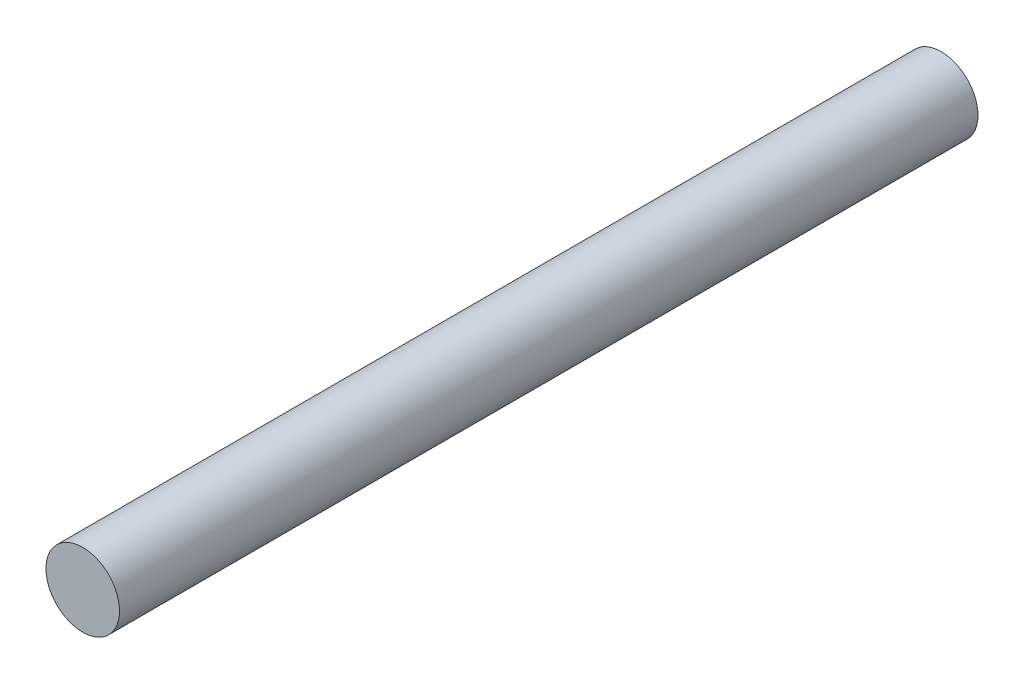
ISO-10303-21;
HEADER;
FILE_DESCRIPTION(('STEP AP214'),'2;1');
FILE_NAME('part.step','',(''),(''),'','','');
FILE_SCHEMA(('AUTOMOTIVE_DESIGN { 1 0 10303 214 1 1 1 1 }'));
ENDSEC;
DATA;
#1=APPLICATION_CONTEXT('core data for automotive mechanical design processes');
#2=APPLICATION_PROTOCOL_DEFINITION('international standard','automotive_design',2000,#1);
#3=PRODUCT_CONTEXT('',#1,'mechanical');
#4=PRODUCT('Part','Part','',(#3));
#5=PRODUCT_RELATED_PRODUCT_CATEGORY('part','',(#4));
#6=PRODUCT_DEFINITION_FORMATION('','',#4);
#7=PRODUCT_DEFINITION_CONTEXT('part definition',#1,'design');
#8=PRODUCT_DEFINITION('design','',#6,#7);
#9=PRODUCT_DEFINITION_SHAPE('','',#8);
#10=(LENGTH_UNIT() NAMED_UNIT(*) SI_UNIT(.MILLI.,.METRE.));
#11=(NAMED_UNIT(*) PLANE_ANGLE_UNIT() SI_UNIT($,.RADIAN.));
#12=(NAMED_UNIT(*) SI_UNIT($,.STERADIAN.) SOLID_ANGLE_UNIT());
#13=UNCERTAINTY_MEASURE_WITH_UNIT(LENGTH_MEASURE(1.E-05),#10,'distance_accuracy_value','');
#14=(GEOMETRIC_REPRESENTATION_CONTEXT(3) GLOBAL_UNCERTAINTY_ASSIGNED_CONTEXT((#13)) GLOBAL_UNIT_ASSIGNED_CONTEXT((#10,
#11,#12)) REPRESENTATION_CONTEXT('',''));
#15=CARTESIAN_POINT('',(0.,0.,0.));
#16=DIRECTION('',(0.,0.,1.));
#17=DIRECTION('',(1.,0.,0.));
#18=AXIS2_PLACEMENT_3D('',#15,#16,#17);
#19=CARTESIAN_POINT('',(0.,0.,70.));
#20=DIRECTION('',(0.,0.,-1.));
#21=DIRECTION('',(-1.,0.,0.));
#22=AXIS2_PLACEMENT_3D('',#19,#20,#21);
#23=CYLINDRICAL_SURFACE('',#22,3.);
#24=CARTESIAN_POINT('',(0.,0.,70.));
#25=DIRECTION('',(0.,0.,1.));
#26=DIRECTION('',(1.,0.,0.));
#27=AXIS2_PLACEMENT_3D('',#24,#25,#26);
#28=CIRCLE('',#27,3.);
#29=CARTESIAN_POINT('',(3.,0.,70.));
#30=VERTEX_POINT('',#29);
#31=EDGE_CURVE('E10',#30,#30,#28,.T.);
#32=ORIENTED_EDGE('',*,*,#31,.F.);
#33=EDGE_LOOP('',(#32));
#34=FACE_BOUND('',#33,.T.);
#35=CARTESIAN_POINT('',(0.,0.,0.));
#36=DIRECTION('',(0.,0.,1.));
#37=DIRECTION('',(1.,0.,0.));
#38=AXIS2_PLACEMENT_3D('',#35,#36,#37);
#39=CIRCLE('',#38,3.);
#40=CARTESIAN_POINT('',(3.,0.,0.));
#41=VERTEX_POINT('',#40);
#42=EDGE_CURVE('E38',#41,#41,#39,.T.);
#43=ORIENTED_EDGE('',*,*,#42,.T.);
#44=EDGE_LOOP('',(#43));
#45=FACE_BOUND('',#44,.T.);
#46=ADVANCED_FACE('F35',(#34,#45),#23,.T.);
#47=CARTESIAN_POINT('',(0.,0.,70.));
#48=DIRECTION('',(0.,0.,1.));
#49=DIRECTION('',(1.,0.,0.));
#50=AXIS2_PLACEMENT_3D('',#47,#48,#49);
#51=PLANE('',#50);
#52=ORIENTED_EDGE('',*,*,#31,.T.);
#53=EDGE_LOOP('',(#52));
#54=FACE_BOUND('',#53,.T.);
#55=ADVANCED_FACE('F50',(#54),#51,.T.);
#56=CARTESIAN_POINT('',(0.,0.,0.));
#57=DIRECTION('',(0.,0.,1.));
#58=DIRECTION('',(1.,0.,0.));
#59=AXIS2_PLACEMENT_3D('',#56,#57,#58);
#60=PLANE('',#59);
#61=ORIENTED_EDGE('',*,*,#42,.F.);
#62=EDGE_LOOP('',(#61));
#63=FACE_BOUND('',#62,.T.);
#64=ADVANCED_FACE('F48',(#63),#60,.F.);
#65=CLOSED_SHELL('',(#46,#55,#64));
#66=MANIFOLD_SOLID_BREP('B2',#65);
#67=ADVANCED_BREP_SHAPE_REPRESENTATION('',(#18,#66),#14);
#68=SHAPE_DEFINITION_REPRESENTATION(#9,#67);
ENDSEC;
END-ISO-10303-21;
